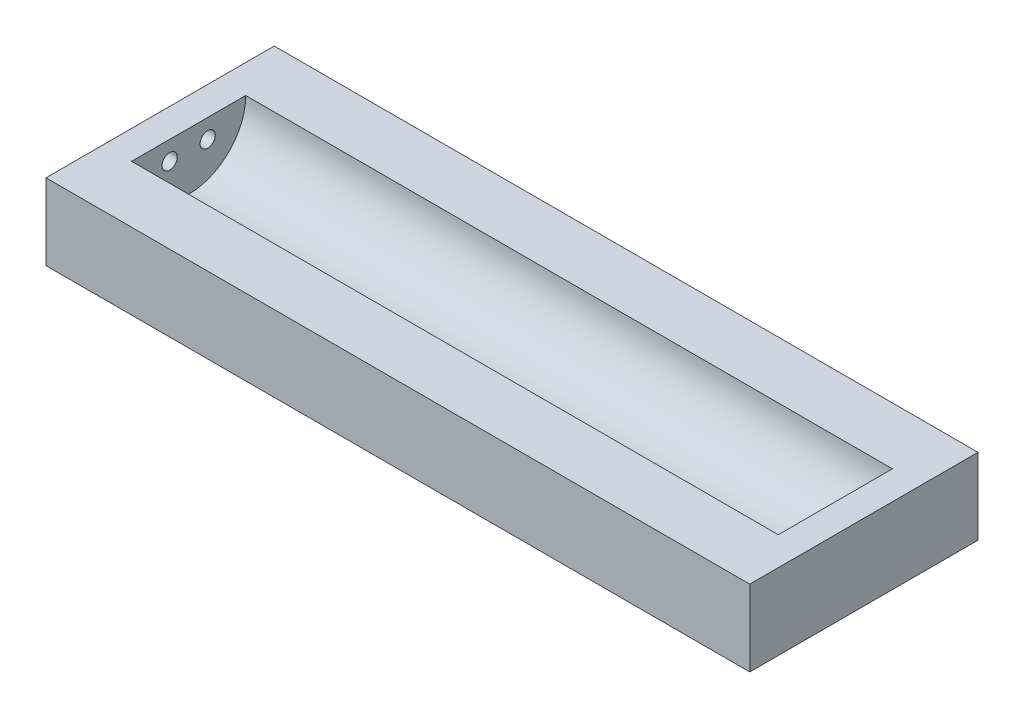
ISO-10303-21;
HEADER;
FILE_DESCRIPTION(('STEP AP214'),'2;1');
FILE_NAME('part.step','',(''),(''),'','','');
FILE_SCHEMA(('AUTOMOTIVE_DESIGN { 1 0 10303 214 1 1 1 1 }'));
ENDSEC;
DATA;
#1=APPLICATION_CONTEXT('core data for automotive mechanical design processes');
#2=APPLICATION_PROTOCOL_DEFINITION('international standard','automotive_design',2000,#1);
#3=PRODUCT_CONTEXT('',#1,'mechanical');
#4=PRODUCT('Part','Part','',(#3));
#5=PRODUCT_RELATED_PRODUCT_CATEGORY('part','',(#4));
#6=PRODUCT_DEFINITION_FORMATION('','',#4);
#7=PRODUCT_DEFINITION_CONTEXT('part definition',#1,'design');
#8=PRODUCT_DEFINITION('design','',#6,#7);
#9=PRODUCT_DEFINITION_SHAPE('','',#8);
#10=(LENGTH_UNIT() NAMED_UNIT(*) SI_UNIT(.MILLI.,.METRE.));
#11=(NAMED_UNIT(*) PLANE_ANGLE_UNIT() SI_UNIT($,.RADIAN.));
#12=(NAMED_UNIT(*) SI_UNIT($,.STERADIAN.) SOLID_ANGLE_UNIT());
#13=UNCERTAINTY_MEASURE_WITH_UNIT(LENGTH_MEASURE(1.E-05),#10,'distance_accuracy_value','');
#14=(GEOMETRIC_REPRESENTATION_CONTEXT(3) GLOBAL_UNCERTAINTY_ASSIGNED_CONTEXT((#13)) GLOBAL_UNIT_ASSIGNED_CONTEXT((#10,
#11,#12)) REPRESENTATION_CONTEXT('',''));
#15=CARTESIAN_POINT('',(0.,0.,0.));
#16=DIRECTION('',(0.,0.,1.));
#17=DIRECTION('',(1.,0.,0.));
#18=AXIS2_PLACEMENT_3D('',#15,#16,#17);
#19=CARTESIAN_POINT('',(2.5,15.,-25.));
#20=DIRECTION('',(1.,0.,0.));
#21=DIRECTION('',(0.,1.,0.));
#22=AXIS2_PLACEMENT_3D('',#19,#20,#21);
#23=PLANE('',#22);
#24=CARTESIAN_POINT('',(2.5,15.,-25.));
#25=DIRECTION('',(1.,0.,0.));
#26=DIRECTION('',(0.,0.,-1.));
#27=AXIS2_PLACEMENT_3D('',#24,#25,#26);
#28=CIRCLE('',#27,2.);
#29=CARTESIAN_POINT('',(2.5,15.,-27.));
#30=VERTEX_POINT('',#29);
#31=EDGE_CURVE('E238',#30,#30,#28,.T.);
#32=ORIENTED_EDGE('',*,*,#31,.T.);
#33=EDGE_LOOP('',(#32));
#34=FACE_BOUND('',#33,.T.);
#35=ADVANCED_FACE('F16',(#34),#23,.T.);
#36=CARTESIAN_POINT('',(2.5,15.,-35.));
#37=DIRECTION('',(-1.,0.,0.));
#38=DIRECTION('',(0.,0.,1.));
#39=AXIS2_PLACEMENT_3D('',#36,#37,#38);
#40=PLANE('',#39);
#41=CARTESIAN_POINT('',(2.5,15.,-35.));
#42=DIRECTION('',(1.,0.,0.));
#43=DIRECTION('',(0.,0.,1.));
#44=AXIS2_PLACEMENT_3D('',#41,#42,#43);
#45=CIRCLE('',#44,2.);
#46=CARTESIAN_POINT('',(2.5,15.,-33.));
#47=VERTEX_POINT('',#46);
#48=EDGE_CURVE('E163',#47,#47,#45,.T.);
#49=ORIENTED_EDGE('',*,*,#48,.T.);
#50=EDGE_LOOP('',(#49));
#51=FACE_BOUND('',#50,.T.);
#52=ADVANCED_FACE('F18',(#51),#40,.F.);
#53=CARTESIAN_POINT('',(7.5,20.,-30.));
#54=DIRECTION('',(-1.,0.,0.));
#55=DIRECTION('',(0.,0.,1.));
#56=AXIS2_PLACEMENT_3D('',#53,#54,#55);
#57=PLANE('',#56);
#58=CARTESIAN_POINT('',(7.5,15.,-35.));
#59=DIRECTION('',(-1.,0.,0.));
#60=DIRECTION('',(0.,0.,1.));
#61=AXIS2_PLACEMENT_3D('',#58,#59,#60);
#62=CIRCLE('',#61,2.);
#63=CARTESIAN_POINT('',(7.5,15.,-33.));
#64=VERTEX_POINT('',#63);
#65=EDGE_CURVE('E162',#64,#64,#62,.T.);
#66=ORIENTED_EDGE('',*,*,#65,.T.);
#67=EDGE_LOOP('',(#66));
#68=FACE_BOUND('',#67,.T.);
#69=CARTESIAN_POINT('',(7.5,15.,-25.));
#70=DIRECTION('',(-1.,0.,0.));
#71=DIRECTION('',(0.,0.,1.));
#72=AXIS2_PLACEMENT_3D('',#69,#70,#71);
#73=CIRCLE('',#72,2.);
#74=CARTESIAN_POINT('',(7.5,15.,-23.));
#75=VERTEX_POINT('',#74);
#76=EDGE_CURVE('E167',#75,#75,#73,.T.);
#77=ORIENTED_EDGE('',*,*,#76,.T.);
#78=EDGE_LOOP('',(#77));
#79=FACE_BOUND('',#78,.T.);
#80=CARTESIAN_POINT('',(7.5,20.,-30.));
#81=DIRECTION('',(-1.,0.,0.));
#82=DIRECTION('',(0.,0.,1.));
#83=AXIS2_PLACEMENT_3D('',#80,#81,#82);
#84=CIRCLE('',#83,15.);
#85=CARTESIAN_POINT('',(7.5,20.,-45.));
#86=VERTEX_POINT('',#85);
#87=CARTESIAN_POINT('',(7.5,20.,-15.));
#88=VERTEX_POINT('',#87);
#89=EDGE_CURVE('E25',#86,#88,#84,.T.);
#90=ORIENTED_EDGE('',*,*,#89,.F.);
#91=DIRECTION('',(0.,0.,-1.));
#92=VECTOR('',#91,1.);
#93=CARTESIAN_POINT('',(7.5,20.,-45.));
#94=LINE('',#93,#92);
#95=EDGE_CURVE('E103',#88,#86,#94,.T.);
#96=ORIENTED_EDGE('',*,*,#95,.F.);
#97=EDGE_LOOP('',(#90,#96));
#98=FACE_BOUND('',#97,.T.);
#99=ADVANCED_FACE('F148',(#68,#79,#98),#57,.F.);
#100=CARTESIAN_POINT('',(177.5,20.,-30.));
#101=DIRECTION('',(-1.,0.,0.));
#102=DIRECTION('',(0.,0.,1.));
#103=AXIS2_PLACEMENT_3D('',#100,#101,#102);
#104=PLANE('',#103);
#105=CARTESIAN_POINT('',(177.5,20.,-30.));
#106=DIRECTION('',(-1.,0.,0.));
#107=DIRECTION('',(0.,0.,1.));
#108=AXIS2_PLACEMENT_3D('',#105,#106,#107);
#109=CIRCLE('',#108,15.);
#110=CARTESIAN_POINT('',(177.5,20.,-45.));
#111=VERTEX_POINT('',#110);
#112=CARTESIAN_POINT('',(177.5,20.,-15.));
#113=VERTEX_POINT('',#112);
#114=EDGE_CURVE('E10',#111,#113,#109,.T.);
#115=ORIENTED_EDGE('',*,*,#114,.T.);
#116=DIRECTION('',(0.,0.,-1.));
#117=VECTOR('',#116,1.);
#118=CARTESIAN_POINT('',(177.5,20.,-45.));
#119=LINE('',#118,#117);
#120=EDGE_CURVE('E101',#113,#111,#119,.T.);
#121=ORIENTED_EDGE('',*,*,#120,.T.);
#122=EDGE_LOOP('',(#115,#121));
#123=FACE_BOUND('',#122,.T.);
#124=ADVANCED_FACE('F107',(#123),#104,.T.);
#125=CARTESIAN_POINT('',(177.5,20.,-30.));
#126=DIRECTION('',(-1.,0.,0.));
#127=DIRECTION('',(0.,0.,1.));
#128=AXIS2_PLACEMENT_3D('',#125,#126,#127);
#129=CYLINDRICAL_SURFACE('',#128,15.);
#130=ORIENTED_EDGE('',*,*,#89,.T.);
#131=DIRECTION('',(-1.,0.,0.));
#132=VECTOR('',#131,1.);
#133=CARTESIAN_POINT('',(177.5,20.,-15.));
#134=LINE('',#133,#132);
#135=EDGE_CURVE('E94',#113,#88,#134,.T.);
#136=ORIENTED_EDGE('',*,*,#135,.F.);
#137=ORIENTED_EDGE('',*,*,#114,.F.);
#138=DIRECTION('',(-1.,0.,0.));
#139=VECTOR('',#138,1.);
#140=CARTESIAN_POINT('',(177.5,20.,-45.));
#141=LINE('',#140,#139);
#142=EDGE_CURVE('E91',#111,#86,#141,.T.);
#143=ORIENTED_EDGE('',*,*,#142,.T.);
#144=EDGE_LOOP('',(#130,#136,#137,#143));
#145=FACE_BOUND('',#144,.T.);
#146=ADVANCED_FACE('F90',(#145),#129,.F.);
#147=CARTESIAN_POINT('',(0.,0.,0.));
#148=DIRECTION('',(0.,-1.,0.));
#149=DIRECTION('',(0.,0.,-1.));
#150=AXIS2_PLACEMENT_3D('',#147,#148,#149);
#151=PLANE('',#150);
#152=DIRECTION('',(0.,0.,1.));
#153=VECTOR('',#152,1.);
#154=CARTESIAN_POINT('',(0.,0.,0.));
#155=LINE('',#154,#153);
#156=CARTESIAN_POINT('',(0.,0.,-60.));
#157=VERTEX_POINT('',#156);
#158=CARTESIAN_POINT('',(0.,0.,0.));
#159=VERTEX_POINT('',#158);
#160=EDGE_CURVE('E105',#157,#159,#155,.T.);
#161=ORIENTED_EDGE('',*,*,#160,.F.);
#162=DIRECTION('',(-1.,0.,0.));
#163=VECTOR('',#162,1.);
#164=CARTESIAN_POINT('',(0.,0.,-60.));
#165=LINE('',#164,#163);
#166=CARTESIAN_POINT('',(185.,0.,-60.));
#167=VERTEX_POINT('',#166);
#168=EDGE_CURVE('E38',#167,#157,#165,.T.);
#169=ORIENTED_EDGE('',*,*,#168,.F.);
#170=DIRECTION('',(0.,0.,-1.));
#171=VECTOR('',#170,1.);
#172=CARTESIAN_POINT('',(185.,0.,0.));
#173=LINE('',#172,#171);
#174=CARTESIAN_POINT('',(185.,0.,0.));
#175=VERTEX_POINT('',#174);
#176=EDGE_CURVE('E46',#175,#167,#173,.T.);
#177=ORIENTED_EDGE('',*,*,#176,.F.);
#178=DIRECTION('',(1.,0.,0.));
#179=VECTOR('',#178,1.);
#180=CARTESIAN_POINT('',(0.,0.,0.));
#181=LINE('',#180,#179);
#182=EDGE_CURVE('E130',#159,#175,#181,.T.);
#183=ORIENTED_EDGE('',*,*,#182,.F.);
#184=EDGE_LOOP('',(#161,#169,#177,#183));
#185=FACE_BOUND('',#184,.T.);
#186=ADVANCED_FACE('F192',(#185),#151,.T.);
#187=CARTESIAN_POINT('',(0.,20.,-60.));
#188=DIRECTION('',(0.,0.,1.));
#189=DIRECTION('',(1.,0.,0.));
#190=AXIS2_PLACEMENT_3D('',#187,#188,#189);
#191=PLANE('',#190);
#192=ORIENTED_EDGE('',*,*,#168,.T.);
#193=DIRECTION('',(0.,-1.,0.));
#194=VECTOR('',#193,1.);
#195=CARTESIAN_POINT('',(0.,20.,-60.));
#196=LINE('',#195,#194);
#197=CARTESIAN_POINT('',(0.,20.,-60.));
#198=VERTEX_POINT('',#197);
#199=EDGE_CURVE('E134',#198,#157,#196,.T.);
#200=ORIENTED_EDGE('',*,*,#199,.F.);
#201=DIRECTION('',(-1.,0.,0.));
#202=VECTOR('',#201,1.);
#203=CARTESIAN_POINT('',(0.,20.,-60.));
#204=LINE('',#203,#202);
#205=CARTESIAN_POINT('',(185.,20.,-60.));
#206=VERTEX_POINT('',#205);
#207=EDGE_CURVE('E109',#206,#198,#204,.T.);
#208=ORIENTED_EDGE('',*,*,#207,.F.);
#209=DIRECTION('',(0.,-1.,0.));
#210=VECTOR('',#209,1.);
#211=CARTESIAN_POINT('',(185.,20.,-60.));
#212=LINE('',#211,#210);
#213=EDGE_CURVE('E121',#206,#167,#212,.T.);
#214=ORIENTED_EDGE('',*,*,#213,.T.);
#215=EDGE_LOOP('',(#192,#200,#208,#214));
#216=FACE_BOUND('',#215,.T.);
#217=ADVANCED_FACE('F189',(#216),#191,.F.);
#218=CARTESIAN_POINT('',(185.,20.,0.));
#219=DIRECTION('',(-1.,0.,0.));
#220=DIRECTION('',(0.,0.,1.));
#221=AXIS2_PLACEMENT_3D('',#218,#219,#220);
#222=PLANE('',#221);
#223=ORIENTED_EDGE('',*,*,#176,.T.);
#224=ORIENTED_EDGE('',*,*,#213,.F.);
#225=DIRECTION('',(0.,0.,-1.));
#226=VECTOR('',#225,1.);
#227=CARTESIAN_POINT('',(185.,20.,0.));
#228=LINE('',#227,#226);
#229=CARTESIAN_POINT('',(185.,20.,0.));
#230=VERTEX_POINT('',#229);
#231=EDGE_CURVE('E118',#230,#206,#228,.T.);
#232=ORIENTED_EDGE('',*,*,#231,.F.);
#233=DIRECTION('',(0.,-1.,0.));
#234=VECTOR('',#233,1.);
#235=CARTESIAN_POINT('',(185.,20.,0.));
#236=LINE('',#235,#234);
#237=EDGE_CURVE('E127',#230,#175,#236,.T.);
#238=ORIENTED_EDGE('',*,*,#237,.T.);
#239=EDGE_LOOP('',(#223,#224,#232,#238));
#240=FACE_BOUND('',#239,.T.);
#241=ADVANCED_FACE('F186',(#240),#222,.F.);
#242=CARTESIAN_POINT('',(0.,20.,0.));
#243=DIRECTION('',(0.,0.,-1.));
#244=DIRECTION('',(0.,-1.,0.));
#245=AXIS2_PLACEMENT_3D('',#242,#243,#244);
#246=PLANE('',#245);
#247=ORIENTED_EDGE('',*,*,#182,.T.);
#248=ORIENTED_EDGE('',*,*,#237,.F.);
#249=DIRECTION('',(1.,0.,0.));
#250=VECTOR('',#249,1.);
#251=CARTESIAN_POINT('',(0.,20.,0.));
#252=LINE('',#251,#250);
#253=CARTESIAN_POINT('',(0.,20.,0.));
#254=VERTEX_POINT('',#253);
#255=EDGE_CURVE('E157',#254,#230,#252,.T.);
#256=ORIENTED_EDGE('',*,*,#255,.F.);
#257=DIRECTION('',(0.,-1.,0.));
#258=VECTOR('',#257,1.);
#259=CARTESIAN_POINT('',(0.,20.,0.));
#260=LINE('',#259,#258);
#261=EDGE_CURVE('E126',#254,#159,#260,.T.);
#262=ORIENTED_EDGE('',*,*,#261,.T.);
#263=EDGE_LOOP('',(#247,#248,#256,#262));
#264=FACE_BOUND('',#263,.T.);
#265=ADVANCED_FACE('F184',(#264),#246,.F.);
#266=CARTESIAN_POINT('',(0.,20.,0.));
#267=DIRECTION('',(1.,0.,0.));
#268=DIRECTION('',(0.,1.,0.));
#269=AXIS2_PLACEMENT_3D('',#266,#267,#268);
#270=PLANE('',#269);
#271=ORIENTED_EDGE('',*,*,#160,.T.);
#272=ORIENTED_EDGE('',*,*,#261,.F.);
#273=DIRECTION('',(0.,0.,1.));
#274=VECTOR('',#273,1.);
#275=CARTESIAN_POINT('',(0.,20.,0.));
#276=LINE('',#275,#274);
#277=EDGE_CURVE('E159',#198,#254,#276,.T.);
#278=ORIENTED_EDGE('',*,*,#277,.F.);
#279=ORIENTED_EDGE('',*,*,#199,.T.);
#280=EDGE_LOOP('',(#271,#272,#278,#279));
#281=FACE_BOUND('',#280,.T.);
#282=ADVANCED_FACE('F191',(#281),#270,.F.);
#283=CARTESIAN_POINT('',(0.,20.,0.));
#284=DIRECTION('',(0.,-1.,0.));
#285=DIRECTION('',(0.,0.,-1.));
#286=AXIS2_PLACEMENT_3D('',#283,#284,#285);
#287=PLANE('',#286);
#288=ORIENTED_EDGE('',*,*,#120,.F.);
#289=ORIENTED_EDGE('',*,*,#135,.T.);
#290=ORIENTED_EDGE('',*,*,#95,.T.);
#291=ORIENTED_EDGE('',*,*,#142,.F.);
#292=EDGE_LOOP('',(#288,#289,#290,#291));
#293=FACE_BOUND('',#292,.T.);
#294=ORIENTED_EDGE('',*,*,#277,.T.);
#295=ORIENTED_EDGE('',*,*,#255,.T.);
#296=ORIENTED_EDGE('',*,*,#231,.T.);
#297=ORIENTED_EDGE('',*,*,#207,.T.);
#298=EDGE_LOOP('',(#294,#295,#296,#297));
#299=FACE_BOUND('',#298,.T.);
#300=ADVANCED_FACE('F99',(#293,#299),#287,.F.);
#301=CARTESIAN_POINT('',(2.5,15.,-35.));
#302=DIRECTION('',(1.,0.,0.));
#303=DIRECTION('',(0.,0.,-1.));
#304=AXIS2_PLACEMENT_3D('',#301,#302,#303);
#305=CYLINDRICAL_SURFACE('',#304,2.);
#306=ORIENTED_EDGE('',*,*,#65,.F.);
#307=EDGE_LOOP('',(#306));
#308=FACE_BOUND('',#307,.T.);
#309=ORIENTED_EDGE('',*,*,#48,.F.);
#310=EDGE_LOOP('',(#309));
#311=FACE_BOUND('',#310,.T.);
#312=ADVANCED_FACE('F213',(#308,#311),#305,.F.);
#313=CARTESIAN_POINT('',(2.5,15.,-25.));
#314=DIRECTION('',(1.,0.,0.));
#315=DIRECTION('',(0.,0.,-1.));
#316=AXIS2_PLACEMENT_3D('',#313,#314,#315);
#317=CYLINDRICAL_SURFACE('',#316,2.);
#318=ORIENTED_EDGE('',*,*,#76,.F.);
#319=EDGE_LOOP('',(#318));
#320=FACE_BOUND('',#319,.T.);
#321=ORIENTED_EDGE('',*,*,#31,.F.);
#322=EDGE_LOOP('',(#321));
#323=FACE_BOUND('',#322,.T.);
#324=ADVANCED_FACE('F220',(#320,#323),#317,.F.);
#325=CLOSED_SHELL('',(#35,#52,#99,#124,#146,#186,#217,#241,#265,#282,#300,#312,#324));
#326=MANIFOLD_SOLID_BREP('B1',#325);
#327=ADVANCED_BREP_SHAPE_REPRESENTATION('',(#18,#326),#14);
#328=SHAPE_DEFINITION_REPRESENTATION(#9,#327);
ENDSEC;
END-ISO-10303-21;
